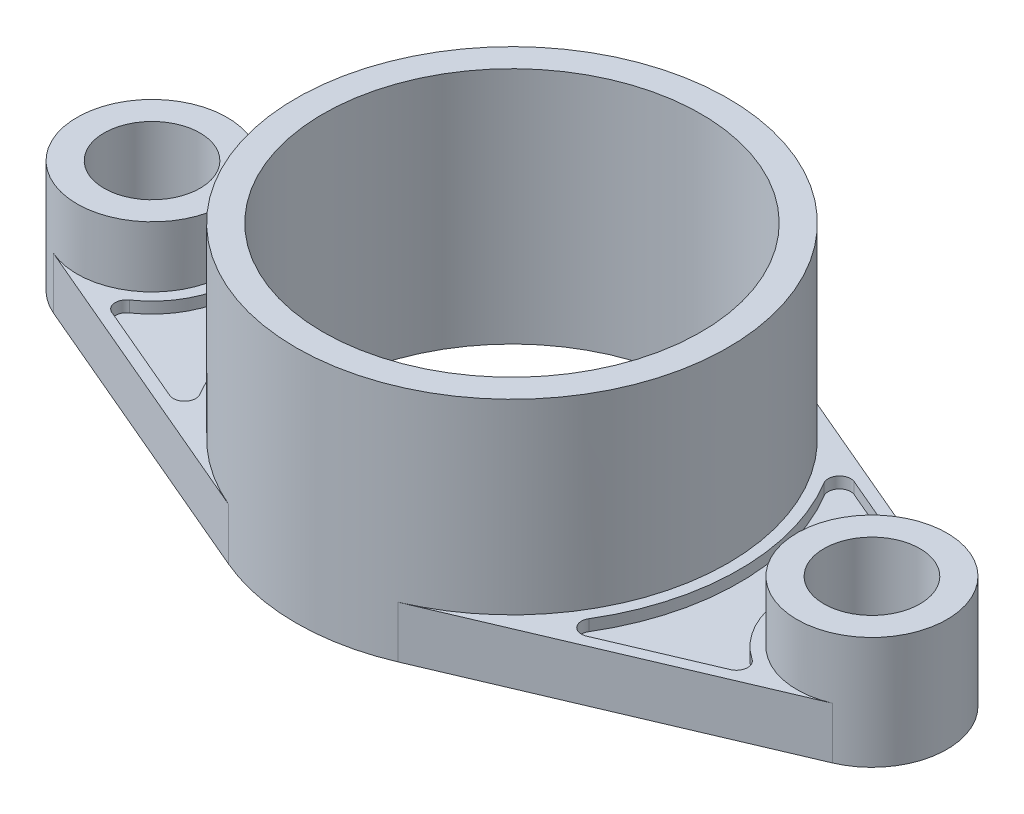
ISO-10303-21;
HEADER;
FILE_DESCRIPTION(('STEP AP214'),'2;1');
FILE_NAME('part.step','',(''),(''),'','','');
FILE_SCHEMA(('AUTOMOTIVE_DESIGN { 1 0 10303 214 1 1 1 1 }'));
ENDSEC;
DATA;
#1=APPLICATION_CONTEXT('core data for automotive mechanical design processes');
#2=APPLICATION_PROTOCOL_DEFINITION('international standard','automotive_design',2000,#1);
#3=PRODUCT_CONTEXT('',#1,'mechanical');
#4=PRODUCT('Part','Part','',(#3));
#5=PRODUCT_RELATED_PRODUCT_CATEGORY('part','',(#4));
#6=PRODUCT_DEFINITION_FORMATION('','',#4);
#7=PRODUCT_DEFINITION_CONTEXT('part definition',#1,'design');
#8=PRODUCT_DEFINITION('design','',#6,#7);
#9=PRODUCT_DEFINITION_SHAPE('','',#8);
#10=(LENGTH_UNIT() NAMED_UNIT(*) SI_UNIT(.MILLI.,.METRE.));
#11=(NAMED_UNIT(*) PLANE_ANGLE_UNIT() SI_UNIT($,.RADIAN.));
#12=(NAMED_UNIT(*) SI_UNIT($,.STERADIAN.) SOLID_ANGLE_UNIT());
#13=UNCERTAINTY_MEASURE_WITH_UNIT(LENGTH_MEASURE(1.E-05),#10,'distance_accuracy_value','');
#14=(GEOMETRIC_REPRESENTATION_CONTEXT(3) GLOBAL_UNCERTAINTY_ASSIGNED_CONTEXT((#13)) GLOBAL_UNIT_ASSIGNED_CONTEXT((#10,
#11,#12)) REPRESENTATION_CONTEXT('',''));
#15=CARTESIAN_POINT('',(0.,0.,0.));
#16=DIRECTION('',(0.,0.,1.));
#17=DIRECTION('',(1.,0.,0.));
#18=AXIS2_PLACEMENT_3D('',#15,#16,#17);
#19=CARTESIAN_POINT('',(0.,11.5,0.));
#20=DIRECTION('',(0.,1.,0.));
#21=DIRECTION('',(0.,0.,1.));
#22=AXIS2_PLACEMENT_3D('',#19,#20,#21);
#23=PLANE('',#22);
#24=DIRECTION('',(-0.920107179747132,0.,-0.391666666666669));
#25=VECTOR('',#24,1.);
#26=CARTESIAN_POINT('',(18.8000000000001,11.5,-44.1651446278623));
#27=LINE('',#26,#25);
#28=CARTESIAN_POINT('',(86.5277777777778,11.5,-15.335119662452));
#29=VERTEX_POINT('',#28);
#30=CARTESIAN_POINT('',(18.8000000000001,11.5,-44.1651446278623));
#31=VERTEX_POINT('',#30);
#32=EDGE_CURVE('E366',#29,#31,#27,.T.);
#33=ORIENTED_EDGE('',*,*,#32,.T.);
#34=CARTESIAN_POINT('',(0.,11.5,0.));
#35=DIRECTION('',(0.,1.,0.));
#36=DIRECTION('',(0.,0.,1.));
#37=AXIS2_PLACEMENT_3D('',#34,#35,#36);
#38=CIRCLE('',#37,48.);
#39=CARTESIAN_POINT('',(18.8000000000001,11.5,44.1651446278623));
#40=VERTEX_POINT('',#39);
#41=EDGE_CURVE('E341',#31,#40,#38,.F.);
#42=ORIENTED_EDGE('',*,*,#41,.T.);
#43=DIRECTION('',(-0.920107179747132,0.,0.391666666666669));
#44=VECTOR('',#43,1.);
#45=CARTESIAN_POINT('',(18.8000000000001,11.5,44.1651446278623));
#46=LINE('',#45,#44);
#47=CARTESIAN_POINT('',(86.5277777777777,11.5,15.335119662452));
#48=VERTEX_POINT('',#47);
#49=EDGE_CURVE('E363',#48,#40,#46,.T.);
#50=ORIENTED_EDGE('',*,*,#49,.F.);
#51=CARTESIAN_POINT('',(80.,11.5,0.));
#52=DIRECTION('',(0.,1.,0.));
#53=DIRECTION('',(0.,0.,1.));
#54=AXIS2_PLACEMENT_3D('',#51,#52,#53);
#55=CIRCLE('',#54,16.6666666666665);
#56=EDGE_CURVE('E352',#48,#29,#55,.F.);
#57=ORIENTED_EDGE('',*,*,#56,.T.);
#58=EDGE_LOOP('',(#33,#42,#50,#57));
#59=FACE_BOUND('',#58,.T.);
#60=DIRECTION('',(-0.920107179747132,0.,0.391666666666669));
#61=VECTOR('',#60,1.);
#62=CARTESIAN_POINT('',(68.749829188779,11.5,20.1856739916239));
#63=LINE('',#62,#61);
#64=CARTESIAN_POINT('',(68.749829188779,11.5,20.1856739916239));
#65=VERTEX_POINT('',#64);
#66=CARTESIAN_POINT('',(46.3293116044256,11.5,29.7295288603779));
#67=VERTEX_POINT('',#66);
#68=EDGE_CURVE('E244',#65,#67,#63,.T.);
#69=ORIENTED_EDGE('',*,*,#68,.T.);
#70=CARTESIAN_POINT('',(45.3501449377589,11.5,27.4292609110101));
#71=DIRECTION('',(0.,-1.,0.));
#72=DIRECTION('',(0.,0.,1.));
#73=AXIS2_PLACEMENT_3D('',#70,#71,#72);
#74=CIRCLE('',#73,2.5);
#75=CARTESIAN_POINT('',(43.2109871576759,11.5,26.13542784917));
#76=VERTEX_POINT('',#75);
#77=EDGE_CURVE('E60',#67,#76,#74,.T.);
#78=ORIENTED_EDGE('',*,*,#77,.T.);
#79=CARTESIAN_POINT('',(0.,11.5,0.));
#80=DIRECTION('',(0.,1.,0.));
#81=DIRECTION('',(0.,0.,1.));
#82=AXIS2_PLACEMENT_3D('',#79,#80,#81);
#83=CIRCLE('',#82,50.5);
#84=CARTESIAN_POINT('',(43.2109871576759,11.5,-26.1354278491699));
#85=VERTEX_POINT('',#84);
#86=EDGE_CURVE('E227',#76,#85,#83,.T.);
#87=ORIENTED_EDGE('',*,*,#86,.T.);
#88=CARTESIAN_POINT('',(45.3501449377589,11.5,-27.42926091101));
#89=DIRECTION('',(0.,-1.,0.));
#90=DIRECTION('',(0.,0.,1.));
#91=AXIS2_PLACEMENT_3D('',#88,#89,#90);
#92=CIRCLE('',#91,2.50000000000001);
#93=CARTESIAN_POINT('',(46.3293116044256,11.5,-29.7295288603779));
#94=VERTEX_POINT('',#93);
#95=EDGE_CURVE('E230',#85,#94,#92,.T.);
#96=ORIENTED_EDGE('',*,*,#95,.T.);
#97=DIRECTION('',(0.920107179747131,0.,0.39166666666667));
#98=VECTOR('',#97,1.);
#99=CARTESIAN_POINT('',(46.3293116044256,11.5,-29.7295288603779));
#100=LINE('',#99,#98);
#101=CARTESIAN_POINT('',(68.749829188779,11.5,-20.1856739916239));
#102=VERTEX_POINT('',#101);
#103=EDGE_CURVE('E255',#94,#102,#100,.T.);
#104=ORIENTED_EDGE('',*,*,#103,.T.);
#105=CARTESIAN_POINT('',(67.7706625221123,11.5,-17.8854060422561));
#106=DIRECTION('',(0.,-1.,0.));
#107=DIRECTION('',(0.,0.,1.));
#108=AXIS2_PLACEMENT_3D('',#105,#106,#107);
#109=CIRCLE('',#108,2.5);
#110=CARTESIAN_POINT('',(69.1817399234071,11.5,-15.8217053450726));
#111=VERTEX_POINT('',#110);
#112=EDGE_CURVE('E252',#102,#111,#109,.T.);
#113=ORIENTED_EDGE('',*,*,#112,.T.);
#114=CARTESIAN_POINT('',(80.,11.5,0.));
#115=DIRECTION('',(0.,1.,0.));
#116=DIRECTION('',(0.,0.,1.));
#117=AXIS2_PLACEMENT_3D('',#114,#115,#116);
#118=CIRCLE('',#117,19.1666666666665);
#119=CARTESIAN_POINT('',(69.1817399234071,11.5,15.8217053450727));
#120=VERTEX_POINT('',#119);
#121=EDGE_CURVE('E249',#111,#120,#118,.T.);
#122=ORIENTED_EDGE('',*,*,#121,.T.);
#123=CARTESIAN_POINT('',(67.7706625221124,11.5,17.8854060422561));
#124=DIRECTION('',(0.,-1.,0.));
#125=DIRECTION('',(0.,0.,-1.));
#126=AXIS2_PLACEMENT_3D('',#123,#124,#125);
#127=CIRCLE('',#126,2.5);
#128=EDGE_CURVE('E246',#120,#65,#127,.T.);
#129=ORIENTED_EDGE('',*,*,#128,.T.);
#130=EDGE_LOOP('',(#69,#78,#87,#96,#104,#113,#122,#129));
#131=FACE_BOUND('',#130,.T.);
#132=ADVANCED_FACE('F45',(#59,#131),#23,.T.);
#133=DIRECTION('',(0.920107179747132,0.,0.391666666666669));
#134=VECTOR('',#133,1.);
#135=CARTESIAN_POINT('',(-18.8000000000001,11.5,44.1651446278623));
#136=LINE('',#135,#134);
#137=CARTESIAN_POINT('',(-86.5277777777777,11.5,15.335119662452));
#138=VERTEX_POINT('',#137);
#139=CARTESIAN_POINT('',(-18.8000000000001,11.5,44.1651446278623));
#140=VERTEX_POINT('',#139);
#141=EDGE_CURVE('E361',#138,#140,#136,.T.);
#142=ORIENTED_EDGE('',*,*,#141,.T.);
#143=CARTESIAN_POINT('',(-18.8000000000001,11.5,-44.1651446278623));
#144=VERTEX_POINT('',#143);
#145=EDGE_CURVE('E342',#140,#144,#38,.F.);
#146=ORIENTED_EDGE('',*,*,#145,.T.);
#147=DIRECTION('',(0.920107179747132,0.,-0.391666666666669));
#148=VECTOR('',#147,1.);
#149=CARTESIAN_POINT('',(-18.8000000000001,11.5,-44.1651446278623));
#150=LINE('',#149,#148);
#151=CARTESIAN_POINT('',(-86.5277777777777,11.5,-15.335119662452));
#152=VERTEX_POINT('',#151);
#153=EDGE_CURVE('E368',#152,#144,#150,.T.);
#154=ORIENTED_EDGE('',*,*,#153,.F.);
#155=CARTESIAN_POINT('',(-80.,11.5,0.));
#156=DIRECTION('',(0.,1.,0.));
#157=DIRECTION('',(0.,0.,1.));
#158=AXIS2_PLACEMENT_3D('',#155,#156,#157);
#159=CIRCLE('',#158,16.6666666666665);
#160=EDGE_CURVE('E358',#152,#138,#159,.F.);
#161=ORIENTED_EDGE('',*,*,#160,.T.);
#162=EDGE_LOOP('',(#142,#146,#154,#161));
#163=FACE_BOUND('',#162,.T.);
#164=CARTESIAN_POINT('',(-45.3501449377589,11.5,27.4292609110101));
#165=DIRECTION('',(0.,1.,0.));
#166=DIRECTION('',(0.,0.,1.));
#167=AXIS2_PLACEMENT_3D('',#164,#165,#166);
#168=CIRCLE('',#167,2.5);
#169=CARTESIAN_POINT('',(-46.3293116044256,11.5,29.7295288603779));
#170=VERTEX_POINT('',#169);
#171=CARTESIAN_POINT('',(-43.2109871576759,11.5,26.13542784917));
#172=VERTEX_POINT('',#171);
#173=EDGE_CURVE('E68',#170,#172,#168,.T.);
#174=ORIENTED_EDGE('',*,*,#173,.F.);
#175=DIRECTION('',(0.920107179747132,0.,0.391666666666669));
#176=VECTOR('',#175,1.);
#177=CARTESIAN_POINT('',(-68.749829188779,11.5,20.1856739916239));
#178=LINE('',#177,#176);
#179=CARTESIAN_POINT('',(-68.749829188779,11.5,20.1856739916239));
#180=VERTEX_POINT('',#179);
#181=EDGE_CURVE('E277',#180,#170,#178,.T.);
#182=ORIENTED_EDGE('',*,*,#181,.F.);
#183=CARTESIAN_POINT('',(-67.7706625221124,11.5,17.8854060422561));
#184=DIRECTION('',(0.,1.,0.));
#185=DIRECTION('',(0.,0.,-1.));
#186=AXIS2_PLACEMENT_3D('',#183,#184,#185);
#187=CIRCLE('',#186,2.5);
#188=CARTESIAN_POINT('',(-69.1817399234071,11.5,15.8217053450727));
#189=VERTEX_POINT('',#188);
#190=EDGE_CURVE('E315',#189,#180,#187,.T.);
#191=ORIENTED_EDGE('',*,*,#190,.F.);
#192=CARTESIAN_POINT('',(-80.,11.5,0.));
#193=DIRECTION('',(0.,-1.,0.));
#194=DIRECTION('',(0.,0.,1.));
#195=AXIS2_PLACEMENT_3D('',#192,#193,#194);
#196=CIRCLE('',#195,19.1666666666665);
#197=CARTESIAN_POINT('',(-69.1817399234071,11.5,-15.8217053450726));
#198=VERTEX_POINT('',#197);
#199=EDGE_CURVE('E312',#198,#189,#196,.T.);
#200=ORIENTED_EDGE('',*,*,#199,.F.);
#201=CARTESIAN_POINT('',(-67.7706625221123,11.5,-17.8854060422561));
#202=DIRECTION('',(0.,1.,0.));
#203=DIRECTION('',(0.,0.,1.));
#204=AXIS2_PLACEMENT_3D('',#201,#202,#203);
#205=CIRCLE('',#204,2.5);
#206=CARTESIAN_POINT('',(-68.749829188779,11.5,-20.1856739916239));
#207=VERTEX_POINT('',#206);
#208=EDGE_CURVE('E309',#207,#198,#205,.T.);
#209=ORIENTED_EDGE('',*,*,#208,.F.);
#210=DIRECTION('',(-0.920107179747131,0.,0.39166666666667));
#211=VECTOR('',#210,1.);
#212=CARTESIAN_POINT('',(-46.3293116044256,11.5,-29.7295288603779));
#213=LINE('',#212,#211);
#214=CARTESIAN_POINT('',(-46.3293116044256,11.5,-29.7295288603779));
#215=VERTEX_POINT('',#214);
#216=EDGE_CURVE('E306',#215,#207,#213,.T.);
#217=ORIENTED_EDGE('',*,*,#216,.F.);
#218=CARTESIAN_POINT('',(-45.3501449377589,11.5,-27.42926091101));
#219=DIRECTION('',(0.,1.,0.));
#220=DIRECTION('',(0.,0.,1.));
#221=AXIS2_PLACEMENT_3D('',#218,#219,#220);
#222=CIRCLE('',#221,2.50000000000001);
#223=CARTESIAN_POINT('',(-43.2109871576759,11.5,-26.1354278491699));
#224=VERTEX_POINT('',#223);
#225=EDGE_CURVE('E303',#224,#215,#222,.T.);
#226=ORIENTED_EDGE('',*,*,#225,.F.);
#227=CARTESIAN_POINT('',(0.,11.5,0.));
#228=DIRECTION('',(0.,-1.,0.));
#229=DIRECTION('',(0.,0.,1.));
#230=AXIS2_PLACEMENT_3D('',#227,#228,#229);
#231=CIRCLE('',#230,50.5);
#232=EDGE_CURVE('E300',#172,#224,#231,.T.);
#233=ORIENTED_EDGE('',*,*,#232,.F.);
#234=EDGE_LOOP('',(#174,#182,#191,#200,#209,#217,#226,#233));
#235=FACE_BOUND('',#234,.T.);
#236=ADVANCED_FACE('F449',(#163,#235),#23,.T.);
#237=CARTESIAN_POINT('',(-80.,11.5,0.));
#238=DIRECTION('',(0.,-1.,0.));
#239=DIRECTION('',(0.,0.,-1.));
#240=AXIS2_PLACEMENT_3D('',#237,#238,#239);
#241=CYLINDRICAL_SURFACE('',#240,16.6666666666665);
#242=CARTESIAN_POINT('',(-80.,0.,0.));
#243=DIRECTION('',(0.,1.,0.));
#244=DIRECTION('',(0.,0.,1.));
#245=AXIS2_PLACEMENT_3D('',#242,#243,#244);
#246=CIRCLE('',#245,16.6666666666665);
#247=CARTESIAN_POINT('',(-86.5277777777777,0.,-15.335119662452));
#248=VERTEX_POINT('',#247);
#249=CARTESIAN_POINT('',(-86.5277777777777,0.,15.335119662452));
#250=VERTEX_POINT('',#249);
#251=EDGE_CURVE('E374',#248,#250,#246,.T.);
#252=ORIENTED_EDGE('',*,*,#251,.T.);
#253=DIRECTION('',(0.,-1.,0.));
#254=VECTOR('',#253,1.);
#255=CARTESIAN_POINT('',(-86.5277777777777,11.5,15.335119662452));
#256=LINE('',#255,#254);
#257=EDGE_CURVE('E11',#138,#250,#256,.T.);
#258=ORIENTED_EDGE('',*,*,#257,.F.);
#259=ORIENTED_EDGE('',*,*,#160,.F.);
#260=DIRECTION('',(0.,-1.,0.));
#261=VECTOR('',#260,1.);
#262=CARTESIAN_POINT('',(-86.5277777777777,11.5,-15.335119662452));
#263=LINE('',#262,#261);
#264=EDGE_CURVE('E371',#152,#248,#263,.T.);
#265=ORIENTED_EDGE('',*,*,#264,.T.);
#266=EDGE_LOOP('',(#252,#258,#259,#265));
#267=FACE_BOUND('',#266,.T.);
#268=CARTESIAN_POINT('',(-80.,25.,0.));
#269=DIRECTION('',(0.,1.,0.));
#270=DIRECTION('',(0.,0.,1.));
#271=AXIS2_PLACEMENT_3D('',#268,#269,#270);
#272=CIRCLE('',#271,16.6666666666665);
#273=CARTESIAN_POINT('',(-80.,25.,16.6666666666665));
#274=VERTEX_POINT('',#273);
#275=EDGE_CURVE('E348',#274,#274,#272,.T.);
#276=ORIENTED_EDGE('',*,*,#275,.F.);
#277=EDGE_LOOP('',(#276));
#278=FACE_BOUND('',#277,.T.);
#279=ADVANCED_FACE('F454',(#267,#278),#241,.T.);
#280=CARTESIAN_POINT('',(-18.8000000000001,11.5,44.1651446278623));
#281=DIRECTION('',(0.391666666666669,0.,-0.920107179747132));
#282=DIRECTION('',(-0.920107179747132,0.,-0.391666666666669));
#283=AXIS2_PLACEMENT_3D('',#280,#281,#282);
#284=PLANE('',#283);
#285=DIRECTION('',(0.920107179747132,0.,0.391666666666669));
#286=VECTOR('',#285,1.);
#287=CARTESIAN_POINT('',(-18.8000000000001,0.,44.1651446278623));
#288=LINE('',#287,#286);
#289=CARTESIAN_POINT('',(-18.8000000000001,0.,44.1651446278623));
#290=VERTEX_POINT('',#289);
#291=EDGE_CURVE('E377',#250,#290,#288,.T.);
#292=ORIENTED_EDGE('',*,*,#291,.T.);
#293=DIRECTION('',(0.,-1.,0.));
#294=VECTOR('',#293,1.);
#295=CARTESIAN_POINT('',(-18.8000000000001,11.5,44.1651446278623));
#296=LINE('',#295,#294);
#297=EDGE_CURVE('E53',#140,#290,#296,.T.);
#298=ORIENTED_EDGE('',*,*,#297,.F.);
#299=ORIENTED_EDGE('',*,*,#141,.F.);
#300=ORIENTED_EDGE('',*,*,#257,.T.);
#301=EDGE_LOOP('',(#292,#298,#299,#300));
#302=FACE_BOUND('',#301,.T.);
#303=ADVANCED_FACE('F452',(#302),#284,.F.);
#304=CARTESIAN_POINT('',(18.8000000000001,11.5,44.1651446278623));
#305=DIRECTION('',(0.391666666666669,0.,0.920107179747132));
#306=DIRECTION('',(0.920107179747132,0.,-0.391666666666669));
#307=AXIS2_PLACEMENT_3D('',#304,#305,#306);
#308=PLANE('',#307);
#309=DIRECTION('',(-0.920107179747132,0.,0.391666666666669));
#310=VECTOR('',#309,1.);
#311=CARTESIAN_POINT('',(18.8000000000001,0.,44.1651446278623));
#312=LINE('',#311,#310);
#313=CARTESIAN_POINT('',(86.5277777777777,0.,15.335119662452));
#314=VERTEX_POINT('',#313);
#315=CARTESIAN_POINT('',(18.8000000000001,0.,44.1651446278623));
#316=VERTEX_POINT('',#315);
#317=EDGE_CURVE('E382',#314,#316,#312,.T.);
#318=ORIENTED_EDGE('',*,*,#317,.F.);
#319=DIRECTION('',(0.,-1.,0.));
#320=VECTOR('',#319,1.);
#321=CARTESIAN_POINT('',(86.5277777777777,11.5,15.335119662452));
#322=LINE('',#321,#320);
#323=EDGE_CURVE('E407',#48,#314,#322,.T.);
#324=ORIENTED_EDGE('',*,*,#323,.F.);
#325=ORIENTED_EDGE('',*,*,#49,.T.);
#326=DIRECTION('',(0.,-1.,0.));
#327=VECTOR('',#326,1.);
#328=CARTESIAN_POINT('',(18.8000000000001,11.5,44.1651446278623));
#329=LINE('',#328,#327);
#330=EDGE_CURVE('E409',#40,#316,#329,.T.);
#331=ORIENTED_EDGE('',*,*,#330,.T.);
#332=EDGE_LOOP('',(#318,#324,#325,#331));
#333=FACE_BOUND('',#332,.T.);
#334=ADVANCED_FACE('F431',(#333),#308,.T.);
#335=CARTESIAN_POINT('',(80.,11.5,0.));
#336=DIRECTION('',(0.,-1.,0.));
#337=DIRECTION('',(0.,0.,-1.));
#338=AXIS2_PLACEMENT_3D('',#335,#336,#337);
#339=CYLINDRICAL_SURFACE('',#338,16.6666666666665);
#340=CARTESIAN_POINT('',(80.,0.,0.));
#341=DIRECTION('',(0.,1.,0.));
#342=DIRECTION('',(0.,0.,1.));
#343=AXIS2_PLACEMENT_3D('',#340,#341,#342);
#344=CIRCLE('',#343,16.6666666666665);
#345=CARTESIAN_POINT('',(86.5277777777778,0.,-15.335119662452));
#346=VERTEX_POINT('',#345);
#347=EDGE_CURVE('E386',#314,#346,#344,.T.);
#348=ORIENTED_EDGE('',*,*,#347,.T.);
#349=DIRECTION('',(0.,-1.,0.));
#350=VECTOR('',#349,1.);
#351=CARTESIAN_POINT('',(86.5277777777778,11.5,-15.335119662452));
#352=LINE('',#351,#350);
#353=EDGE_CURVE('E404',#29,#346,#352,.T.);
#354=ORIENTED_EDGE('',*,*,#353,.F.);
#355=ORIENTED_EDGE('',*,*,#56,.F.);
#356=ORIENTED_EDGE('',*,*,#323,.T.);
#357=EDGE_LOOP('',(#348,#354,#355,#356));
#358=FACE_BOUND('',#357,.T.);
#359=CARTESIAN_POINT('',(80.,25.,0.));
#360=DIRECTION('',(0.,1.,0.));
#361=DIRECTION('',(0.,0.,1.));
#362=AXIS2_PLACEMENT_3D('',#359,#360,#361);
#363=CIRCLE('',#362,16.6666666666665);
#364=CARTESIAN_POINT('',(80.,25.,16.6666666666665));
#365=VERTEX_POINT('',#364);
#366=EDGE_CURVE('E349',#365,#365,#363,.T.);
#367=ORIENTED_EDGE('',*,*,#366,.F.);
#368=EDGE_LOOP('',(#367));
#369=FACE_BOUND('',#368,.T.);
#370=ADVANCED_FACE('F500',(#358,#369),#339,.T.);
#371=CARTESIAN_POINT('',(18.8000000000001,11.5,-44.1651446278623));
#372=DIRECTION('',(-0.391666666666669,0.,0.920107179747132));
#373=DIRECTION('',(0.920107179747132,0.,0.391666666666669));
#374=AXIS2_PLACEMENT_3D('',#371,#372,#373);
#375=PLANE('',#374);
#376=DIRECTION('',(-0.920107179747132,0.,-0.391666666666669));
#377=VECTOR('',#376,1.);
#378=CARTESIAN_POINT('',(18.8000000000001,0.,-44.1651446278623));
#379=LINE('',#378,#377);
#380=CARTESIAN_POINT('',(18.8000000000001,0.,-44.1651446278623));
#381=VERTEX_POINT('',#380);
#382=EDGE_CURVE('E388',#346,#381,#379,.T.);
#383=ORIENTED_EDGE('',*,*,#382,.T.);
#384=DIRECTION('',(0.,-1.,0.));
#385=VECTOR('',#384,1.);
#386=CARTESIAN_POINT('',(18.8000000000001,11.5,-44.1651446278623));
#387=LINE('',#386,#385);
#388=EDGE_CURVE('E401',#31,#381,#387,.T.);
#389=ORIENTED_EDGE('',*,*,#388,.F.);
#390=ORIENTED_EDGE('',*,*,#32,.F.);
#391=ORIENTED_EDGE('',*,*,#353,.T.);
#392=EDGE_LOOP('',(#383,#389,#390,#391));
#393=FACE_BOUND('',#392,.T.);
#394=ADVANCED_FACE('F441',(#393),#375,.F.);
#395=CARTESIAN_POINT('',(0.,11.5,0.));
#396=DIRECTION('',(0.,-1.,0.));
#397=DIRECTION('',(0.,0.,-1.));
#398=AXIS2_PLACEMENT_3D('',#395,#396,#397);
#399=CYLINDRICAL_SURFACE('',#398,48.);
#400=CARTESIAN_POINT('',(0.,0.,0.));
#401=DIRECTION('',(0.,1.,0.));
#402=DIRECTION('',(0.,0.,1.));
#403=AXIS2_PLACEMENT_3D('',#400,#401,#402);
#404=CIRCLE('',#403,48.);
#405=CARTESIAN_POINT('',(-18.8000000000001,0.,-44.1651446278623));
#406=VERTEX_POINT('',#405);
#407=EDGE_CURVE('E383',#381,#406,#404,.T.);
#408=ORIENTED_EDGE('',*,*,#407,.T.);
#409=DIRECTION('',(0.,-1.,0.));
#410=VECTOR('',#409,1.);
#411=CARTESIAN_POINT('',(-18.8000000000001,11.5,-44.1651446278623));
#412=LINE('',#411,#410);
#413=EDGE_CURVE('E399',#144,#406,#412,.T.);
#414=ORIENTED_EDGE('',*,*,#413,.F.);
#415=ORIENTED_EDGE('',*,*,#145,.F.);
#416=ORIENTED_EDGE('',*,*,#297,.T.);
#417=EDGE_CURVE('E379',#290,#316,#404,.T.);
#418=ORIENTED_EDGE('',*,*,#417,.T.);
#419=ORIENTED_EDGE('',*,*,#330,.F.);
#420=ORIENTED_EDGE('',*,*,#41,.F.);
#421=ORIENTED_EDGE('',*,*,#388,.T.);
#422=EDGE_LOOP('',(#408,#414,#415,#416,#418,#419,#420,#421));
#423=FACE_BOUND('',#422,.T.);
#424=CARTESIAN_POINT('',(0.,53.,0.));
#425=DIRECTION('',(0.,1.,0.));
#426=DIRECTION('',(0.,0.,1.));
#427=AXIS2_PLACEMENT_3D('',#424,#425,#426);
#428=CIRCLE('',#427,48.);
#429=CARTESIAN_POINT('',(0.,53.,48.));
#430=VERTEX_POINT('',#429);
#431=EDGE_CURVE('E322',#430,#430,#428,.T.);
#432=ORIENTED_EDGE('',*,*,#431,.F.);
#433=EDGE_LOOP('',(#432));
#434=FACE_BOUND('',#433,.T.);
#435=ADVANCED_FACE('F416',(#423,#434),#399,.T.);
#436=CARTESIAN_POINT('',(0.,11.5,0.));
#437=DIRECTION('',(0.,-1.,0.));
#438=DIRECTION('',(0.,0.,-1.));
#439=AXIS2_PLACEMENT_3D('',#436,#437,#438);
#440=CYLINDRICAL_SURFACE('',#439,42.);
#441=CARTESIAN_POINT('',(0.,0.,0.));
#442=DIRECTION('',(0.,1.,0.));
#443=DIRECTION('',(0.,0.,1.));
#444=AXIS2_PLACEMENT_3D('',#441,#442,#443);
#445=CIRCLE('',#444,42.);
#446=CARTESIAN_POINT('',(0.,0.,42.));
#447=VERTEX_POINT('',#446);
#448=EDGE_CURVE('E393',#447,#447,#445,.T.);
#449=ORIENTED_EDGE('',*,*,#448,.F.);
#450=EDGE_LOOP('',(#449));
#451=FACE_BOUND('',#450,.T.);
#452=CARTESIAN_POINT('',(0.,53.,0.));
#453=DIRECTION('',(0.,1.,0.));
#454=DIRECTION('',(0.,0.,1.));
#455=AXIS2_PLACEMENT_3D('',#452,#453,#454);
#456=CIRCLE('',#455,42.);
#457=CARTESIAN_POINT('',(0.,53.,42.));
#458=VERTEX_POINT('',#457);
#459=EDGE_CURVE('E338',#458,#458,#456,.T.);
#460=ORIENTED_EDGE('',*,*,#459,.T.);
#461=EDGE_LOOP('',(#460));
#462=FACE_BOUND('',#461,.T.);
#463=ADVANCED_FACE('F490',(#451,#462),#440,.F.);
#464=CARTESIAN_POINT('',(-18.8000000000001,11.5,-44.1651446278623));
#465=DIRECTION('',(-0.391666666666669,0.,-0.920107179747132));
#466=DIRECTION('',(-0.920107179747132,0.,0.391666666666669));
#467=AXIS2_PLACEMENT_3D('',#464,#465,#466);
#468=PLANE('',#467);
#469=DIRECTION('',(0.920107179747132,0.,-0.391666666666669));
#470=VECTOR('',#469,1.);
#471=CARTESIAN_POINT('',(-18.8000000000001,0.,-44.1651446278623));
#472=LINE('',#471,#470);
#473=EDGE_CURVE('E390',#248,#406,#472,.T.);
#474=ORIENTED_EDGE('',*,*,#473,.F.);
#475=ORIENTED_EDGE('',*,*,#264,.F.);
#476=ORIENTED_EDGE('',*,*,#153,.T.);
#477=ORIENTED_EDGE('',*,*,#413,.T.);
#478=EDGE_LOOP('',(#474,#475,#476,#477));
#479=FACE_BOUND('',#478,.T.);
#480=ADVANCED_FACE('F446',(#479),#468,.T.);
#481=CARTESIAN_POINT('',(-80.,11.5,0.));
#482=DIRECTION('',(0.,-1.,0.));
#483=DIRECTION('',(0.,0.,-1.));
#484=AXIS2_PLACEMENT_3D('',#481,#482,#483);
#485=CYLINDRICAL_SURFACE('',#484,10.6666666666667);
#486=CARTESIAN_POINT('',(-80.,0.,0.));
#487=DIRECTION('',(0.,1.,0.));
#488=DIRECTION('',(0.,0.,1.));
#489=AXIS2_PLACEMENT_3D('',#486,#487,#488);
#490=CIRCLE('',#489,10.6666666666667);
#491=CARTESIAN_POINT('',(-80.,0.,10.6666666666667));
#492=VERTEX_POINT('',#491);
#493=EDGE_CURVE('E360',#492,#492,#490,.T.);
#494=ORIENTED_EDGE('',*,*,#493,.F.);
#495=EDGE_LOOP('',(#494));
#496=FACE_BOUND('',#495,.T.);
#497=CARTESIAN_POINT('',(-80.,25.,0.));
#498=DIRECTION('',(0.,1.,0.));
#499=DIRECTION('',(0.,0.,1.));
#500=AXIS2_PLACEMENT_3D('',#497,#498,#499);
#501=CIRCLE('',#500,10.6666666666667);
#502=CARTESIAN_POINT('',(-80.,25.,10.6666666666667));
#503=VERTEX_POINT('',#502);
#504=EDGE_CURVE('E345',#503,#503,#501,.T.);
#505=ORIENTED_EDGE('',*,*,#504,.T.);
#506=EDGE_LOOP('',(#505));
#507=FACE_BOUND('',#506,.T.);
#508=ADVANCED_FACE('F47',(#496,#507),#485,.F.);
#509=CARTESIAN_POINT('',(80.,11.5,0.));
#510=DIRECTION('',(0.,-1.,0.));
#511=DIRECTION('',(0.,0.,-1.));
#512=AXIS2_PLACEMENT_3D('',#509,#510,#511);
#513=CYLINDRICAL_SURFACE('',#512,10.6666666666667);
#514=CARTESIAN_POINT('',(80.,0.,0.));
#515=DIRECTION('',(0.,1.,0.));
#516=DIRECTION('',(0.,0.,1.));
#517=AXIS2_PLACEMENT_3D('',#514,#515,#516);
#518=CIRCLE('',#517,10.6666666666667);
#519=CARTESIAN_POINT('',(80.,0.,10.6666666666667));
#520=VERTEX_POINT('',#519);
#521=EDGE_CURVE('E364',#520,#520,#518,.T.);
#522=ORIENTED_EDGE('',*,*,#521,.F.);
#523=EDGE_LOOP('',(#522));
#524=FACE_BOUND('',#523,.T.);
#525=CARTESIAN_POINT('',(80.,25.,0.));
#526=DIRECTION('',(0.,1.,0.));
#527=DIRECTION('',(0.,0.,1.));
#528=AXIS2_PLACEMENT_3D('',#525,#526,#527);
#529=CIRCLE('',#528,10.6666666666667);
#530=CARTESIAN_POINT('',(80.,25.,10.6666666666667));
#531=VERTEX_POINT('',#530);
#532=EDGE_CURVE('E344',#531,#531,#529,.T.);
#533=ORIENTED_EDGE('',*,*,#532,.T.);
#534=EDGE_LOOP('',(#533));
#535=FACE_BOUND('',#534,.T.);
#536=ADVANCED_FACE('F486',(#524,#535),#513,.F.);
#537=CARTESIAN_POINT('',(0.,0.,0.));
#538=DIRECTION('',(0.,1.,0.));
#539=DIRECTION('',(0.,0.,1.));
#540=AXIS2_PLACEMENT_3D('',#537,#538,#539);
#541=PLANE('',#540);
#542=ORIENTED_EDGE('',*,*,#417,.F.);
#543=ORIENTED_EDGE('',*,*,#291,.F.);
#544=ORIENTED_EDGE('',*,*,#251,.F.);
#545=ORIENTED_EDGE('',*,*,#473,.T.);
#546=ORIENTED_EDGE('',*,*,#407,.F.);
#547=ORIENTED_EDGE('',*,*,#382,.F.);
#548=ORIENTED_EDGE('',*,*,#347,.F.);
#549=ORIENTED_EDGE('',*,*,#317,.T.);
#550=EDGE_LOOP('',(#542,#543,#544,#545,#546,#547,#548,#549));
#551=FACE_BOUND('',#550,.T.);
#552=ORIENTED_EDGE('',*,*,#448,.T.);
#553=EDGE_LOOP('',(#552));
#554=FACE_BOUND('',#553,.T.);
#555=ORIENTED_EDGE('',*,*,#521,.T.);
#556=EDGE_LOOP('',(#555));
#557=FACE_BOUND('',#556,.T.);
#558=ORIENTED_EDGE('',*,*,#493,.T.);
#559=EDGE_LOOP('',(#558));
#560=FACE_BOUND('',#559,.T.);
#561=ADVANCED_FACE('F423',(#551,#554,#557,#560),#541,.F.);
#562=CARTESIAN_POINT('',(0.,25.,0.));
#563=DIRECTION('',(0.,1.,0.));
#564=DIRECTION('',(0.,0.,1.));
#565=AXIS2_PLACEMENT_3D('',#562,#563,#564);
#566=PLANE('',#565);
#567=ORIENTED_EDGE('',*,*,#532,.F.);
#568=EDGE_LOOP('',(#567));
#569=FACE_BOUND('',#568,.T.);
#570=ORIENTED_EDGE('',*,*,#366,.T.);
#571=EDGE_LOOP('',(#570));
#572=FACE_BOUND('',#571,.T.);
#573=ADVANCED_FACE('F462',(#569,#572),#566,.T.);
#574=CARTESIAN_POINT('',(0.,25.,0.));
#575=DIRECTION('',(0.,1.,0.));
#576=DIRECTION('',(0.,0.,1.));
#577=AXIS2_PLACEMENT_3D('',#574,#575,#576);
#578=PLANE('',#577);
#579=ORIENTED_EDGE('',*,*,#504,.F.);
#580=EDGE_LOOP('',(#579));
#581=FACE_BOUND('',#580,.T.);
#582=ORIENTED_EDGE('',*,*,#275,.T.);
#583=EDGE_LOOP('',(#582));
#584=FACE_BOUND('',#583,.T.);
#585=ADVANCED_FACE('F459',(#581,#584),#578,.T.);
#586=CARTESIAN_POINT('',(0.,53.,0.));
#587=DIRECTION('',(0.,1.,0.));
#588=DIRECTION('',(0.,0.,1.));
#589=AXIS2_PLACEMENT_3D('',#586,#587,#588);
#590=PLANE('',#589);
#591=ORIENTED_EDGE('',*,*,#431,.T.);
#592=EDGE_LOOP('',(#591));
#593=FACE_BOUND('',#592,.T.);
#594=ORIENTED_EDGE('',*,*,#459,.F.);
#595=EDGE_LOOP('',(#594));
#596=FACE_BOUND('',#595,.T.);
#597=ADVANCED_FACE('F461',(#593,#596),#590,.T.);
#598=CARTESIAN_POINT('',(-45.3501449377589,9.,27.4292609110101));
#599=DIRECTION('',(0.,1.,0.));
#600=DIRECTION('',(0.,0.,1.));
#601=AXIS2_PLACEMENT_3D('',#598,#599,#600);
#602=CYLINDRICAL_SURFACE('',#601,2.5);
#603=ORIENTED_EDGE('',*,*,#173,.T.);
#604=DIRECTION('',(0.,1.,0.));
#605=VECTOR('',#604,1.);
#606=CARTESIAN_POINT('',(-43.2109871576759,9.,26.13542784917));
#607=LINE('',#606,#605);
#608=CARTESIAN_POINT('',(-43.2109871576759,9.,26.13542784917));
#609=VERTEX_POINT('',#608);
#610=EDGE_CURVE('E298',#609,#172,#607,.T.);
#611=ORIENTED_EDGE('',*,*,#610,.F.);
#612=CARTESIAN_POINT('',(-45.3501449377589,9.,27.4292609110101));
#613=DIRECTION('',(0.,1.,0.));
#614=DIRECTION('',(0.,0.,1.));
#615=AXIS2_PLACEMENT_3D('',#612,#613,#614);
#616=CIRCLE('',#615,2.5);
#617=CARTESIAN_POINT('',(-46.3293116044256,9.,29.7295288603779));
#618=VERTEX_POINT('',#617);
#619=EDGE_CURVE('E273',#618,#609,#616,.T.);
#620=ORIENTED_EDGE('',*,*,#619,.F.);
#621=DIRECTION('',(0.,1.,0.));
#622=VECTOR('',#621,1.);
#623=CARTESIAN_POINT('',(-46.3293116044256,9.,29.7295288603779));
#624=LINE('',#623,#622);
#625=EDGE_CURVE('E320',#618,#170,#624,.T.);
#626=ORIENTED_EDGE('',*,*,#625,.T.);
#627=EDGE_LOOP('',(#603,#611,#620,#626));
#628=FACE_BOUND('',#627,.T.);
#629=ADVANCED_FACE('F470',(#628),#602,.F.);
#630=CARTESIAN_POINT('',(-68.749829188779,9.,20.1856739916239));
#631=DIRECTION('',(-0.391666666666669,0.,0.920107179747131));
#632=DIRECTION('',(0.920107179747131,0.,0.391666666666669));
#633=AXIS2_PLACEMENT_3D('',#630,#631,#632);
#634=PLANE('',#633);
#635=ORIENTED_EDGE('',*,*,#181,.T.);
#636=ORIENTED_EDGE('',*,*,#625,.F.);
#637=DIRECTION('',(0.920107179747132,0.,0.391666666666669));
#638=VECTOR('',#637,1.);
#639=CARTESIAN_POINT('',(-68.749829188779,9.,20.1856739916239));
#640=LINE('',#639,#638);
#641=CARTESIAN_POINT('',(-68.749829188779,9.,20.1856739916239));
#642=VERTEX_POINT('',#641);
#643=EDGE_CURVE('E295',#642,#618,#640,.T.);
#644=ORIENTED_EDGE('',*,*,#643,.F.);
#645=DIRECTION('',(0.,1.,0.));
#646=VECTOR('',#645,1.);
#647=CARTESIAN_POINT('',(-68.749829188779,9.,20.1856739916239));
#648=LINE('',#647,#646);
#649=EDGE_CURVE('E323',#642,#180,#648,.T.);
#650=ORIENTED_EDGE('',*,*,#649,.T.);
#651=EDGE_LOOP('',(#635,#636,#644,#650));
#652=FACE_BOUND('',#651,.T.);
#653=ADVANCED_FACE('F557',(#652),#634,.F.);
#654=CARTESIAN_POINT('',(-67.7706625221124,9.,17.8854060422561));
#655=DIRECTION('',(0.,1.,0.));
#656=DIRECTION('',(0.,0.,1.));
#657=AXIS2_PLACEMENT_3D('',#654,#655,#656);
#658=CYLINDRICAL_SURFACE('',#657,2.5);
#659=ORIENTED_EDGE('',*,*,#190,.T.);
#660=ORIENTED_EDGE('',*,*,#649,.F.);
#661=CARTESIAN_POINT('',(-67.7706625221124,9.,17.8854060422561));
#662=DIRECTION('',(0.,1.,0.));
#663=DIRECTION('',(0.,0.,-1.));
#664=AXIS2_PLACEMENT_3D('',#661,#662,#663);
#665=CIRCLE('',#664,2.5);
#666=CARTESIAN_POINT('',(-69.1817399234071,9.,15.8217053450727));
#667=VERTEX_POINT('',#666);
#668=EDGE_CURVE('E292',#667,#642,#665,.T.);
#669=ORIENTED_EDGE('',*,*,#668,.F.);
#670=DIRECTION('',(0.,1.,0.));
#671=VECTOR('',#670,1.);
#672=CARTESIAN_POINT('',(-69.1817399234071,9.,15.8217053450727));
#673=LINE('',#672,#671);
#674=EDGE_CURVE('E325',#667,#189,#673,.T.);
#675=ORIENTED_EDGE('',*,*,#674,.T.);
#676=EDGE_LOOP('',(#659,#660,#669,#675));
#677=FACE_BOUND('',#676,.T.);
#678=ADVANCED_FACE('F565',(#677),#658,.F.);
#679=CARTESIAN_POINT('',(-80.,9.,0.));
#680=DIRECTION('',(0.,1.,0.));
#681=DIRECTION('',(0.,0.,1.));
#682=AXIS2_PLACEMENT_3D('',#679,#680,#681);
#683=CYLINDRICAL_SURFACE('',#682,19.1666666666665);
#684=ORIENTED_EDGE('',*,*,#199,.T.);
#685=ORIENTED_EDGE('',*,*,#674,.F.);
#686=CARTESIAN_POINT('',(-80.,9.,0.));
#687=DIRECTION('',(0.,-1.,0.));
#688=DIRECTION('',(0.,0.,1.));
#689=AXIS2_PLACEMENT_3D('',#686,#687,#688);
#690=CIRCLE('',#689,19.1666666666665);
#691=CARTESIAN_POINT('',(-69.1817399234071,9.,-15.8217053450726));
#692=VERTEX_POINT('',#691);
#693=EDGE_CURVE('E289',#692,#667,#690,.T.);
#694=ORIENTED_EDGE('',*,*,#693,.F.);
#695=DIRECTION('',(0.,1.,0.));
#696=VECTOR('',#695,1.);
#697=CARTESIAN_POINT('',(-69.1817399234071,9.,-15.8217053450726));
#698=LINE('',#697,#696);
#699=EDGE_CURVE('E327',#692,#198,#698,.T.);
#700=ORIENTED_EDGE('',*,*,#699,.T.);
#701=EDGE_LOOP('',(#684,#685,#694,#700));
#702=FACE_BOUND('',#701,.T.);
#703=ADVANCED_FACE('F574',(#702),#683,.T.);
#704=CARTESIAN_POINT('',(-67.7706625221123,9.,-17.8854060422561));
#705=DIRECTION('',(0.,1.,0.));
#706=DIRECTION('',(0.,0.,1.));
#707=AXIS2_PLACEMENT_3D('',#704,#705,#706);
#708=CYLINDRICAL_SURFACE('',#707,2.5);
#709=ORIENTED_EDGE('',*,*,#208,.T.);
#710=ORIENTED_EDGE('',*,*,#699,.F.);
#711=CARTESIAN_POINT('',(-67.7706625221123,9.,-17.8854060422561));
#712=DIRECTION('',(0.,1.,0.));
#713=DIRECTION('',(0.,0.,1.));
#714=AXIS2_PLACEMENT_3D('',#711,#712,#713);
#715=CIRCLE('',#714,2.5);
#716=CARTESIAN_POINT('',(-68.749829188779,9.,-20.1856739916239));
#717=VERTEX_POINT('',#716);
#718=EDGE_CURVE('E286',#717,#692,#715,.T.);
#719=ORIENTED_EDGE('',*,*,#718,.F.);
#720=DIRECTION('',(0.,1.,0.));
#721=VECTOR('',#720,1.);
#722=CARTESIAN_POINT('',(-68.749829188779,9.,-20.1856739916239));
#723=LINE('',#722,#721);
#724=EDGE_CURVE('E329',#717,#207,#723,.T.);
#725=ORIENTED_EDGE('',*,*,#724,.T.);
#726=EDGE_LOOP('',(#709,#710,#719,#725));
#727=FACE_BOUND('',#726,.T.);
#728=ADVANCED_FACE('F583',(#727),#708,.F.);
#729=CARTESIAN_POINT('',(-46.3293116044256,9.,-29.7295288603779));
#730=DIRECTION('',(-0.39166666666667,0.,-0.920107179747131));
#731=DIRECTION('',(-0.920107179747131,0.,0.39166666666667));
#732=AXIS2_PLACEMENT_3D('',#729,#730,#731);
#733=PLANE('',#732);
#734=ORIENTED_EDGE('',*,*,#216,.T.);
#735=ORIENTED_EDGE('',*,*,#724,.F.);
#736=DIRECTION('',(-0.920107179747131,0.,0.39166666666667));
#737=VECTOR('',#736,1.);
#738=CARTESIAN_POINT('',(-46.3293116044256,9.,-29.7295288603779));
#739=LINE('',#738,#737);
#740=CARTESIAN_POINT('',(-46.3293116044256,9.,-29.7295288603779));
#741=VERTEX_POINT('',#740);
#742=EDGE_CURVE('E283',#741,#717,#739,.T.);
#743=ORIENTED_EDGE('',*,*,#742,.F.);
#744=DIRECTION('',(0.,1.,0.));
#745=VECTOR('',#744,1.);
#746=CARTESIAN_POINT('',(-46.3293116044256,9.,-29.7295288603779));
#747=LINE('',#746,#745);
#748=EDGE_CURVE('E331',#741,#215,#747,.T.);
#749=ORIENTED_EDGE('',*,*,#748,.T.);
#750=EDGE_LOOP('',(#734,#735,#743,#749));
#751=FACE_BOUND('',#750,.T.);
#752=ADVANCED_FACE('F592',(#751),#733,.F.);
#753=CARTESIAN_POINT('',(-45.3501449377589,9.,-27.42926091101));
#754=DIRECTION('',(0.,1.,0.));
#755=DIRECTION('',(0.,0.,1.));
#756=AXIS2_PLACEMENT_3D('',#753,#754,#755);
#757=CYLINDRICAL_SURFACE('',#756,2.50000000000001);
#758=ORIENTED_EDGE('',*,*,#225,.T.);
#759=ORIENTED_EDGE('',*,*,#748,.F.);
#760=CARTESIAN_POINT('',(-45.3501449377589,9.,-27.42926091101));
#761=DIRECTION('',(0.,1.,0.));
#762=DIRECTION('',(0.,0.,1.));
#763=AXIS2_PLACEMENT_3D('',#760,#761,#762);
#764=CIRCLE('',#763,2.50000000000001);
#765=CARTESIAN_POINT('',(-43.2109871576759,9.,-26.1354278491699));
#766=VERTEX_POINT('',#765);
#767=EDGE_CURVE('E280',#766,#741,#764,.T.);
#768=ORIENTED_EDGE('',*,*,#767,.F.);
#769=DIRECTION('',(0.,1.,0.));
#770=VECTOR('',#769,1.);
#771=CARTESIAN_POINT('',(-43.2109871576759,9.,-26.1354278491699));
#772=LINE('',#771,#770);
#773=EDGE_CURVE('E333',#766,#224,#772,.T.);
#774=ORIENTED_EDGE('',*,*,#773,.T.);
#775=EDGE_LOOP('',(#758,#759,#768,#774));
#776=FACE_BOUND('',#775,.T.);
#777=ADVANCED_FACE('F601',(#776),#757,.F.);
#778=CARTESIAN_POINT('',(0.,9.,0.));
#779=DIRECTION('',(0.,1.,0.));
#780=DIRECTION('',(0.,0.,1.));
#781=AXIS2_PLACEMENT_3D('',#778,#779,#780);
#782=CYLINDRICAL_SURFACE('',#781,50.5);
#783=ORIENTED_EDGE('',*,*,#232,.T.);
#784=ORIENTED_EDGE('',*,*,#773,.F.);
#785=CARTESIAN_POINT('',(0.,9.,0.));
#786=DIRECTION('',(0.,-1.,0.));
#787=DIRECTION('',(0.,0.,1.));
#788=AXIS2_PLACEMENT_3D('',#785,#786,#787);
#789=CIRCLE('',#788,50.5);
#790=EDGE_CURVE('E276',#609,#766,#789,.T.);
#791=ORIENTED_EDGE('',*,*,#790,.F.);
#792=ORIENTED_EDGE('',*,*,#610,.T.);
#793=EDGE_LOOP('',(#783,#784,#791,#792));
#794=FACE_BOUND('',#793,.T.);
#795=ADVANCED_FACE('F610',(#794),#782,.T.);
#796=CARTESIAN_POINT('',(-45.3501449377589,9.,27.4292609110101));
#797=DIRECTION('',(0.,1.,0.));
#798=DIRECTION('',(0.,0.,1.));
#799=AXIS2_PLACEMENT_3D('',#796,#797,#798);
#800=PLANE('',#799);
#801=ORIENTED_EDGE('',*,*,#619,.T.);
#802=ORIENTED_EDGE('',*,*,#790,.T.);
#803=ORIENTED_EDGE('',*,*,#767,.T.);
#804=ORIENTED_EDGE('',*,*,#742,.T.);
#805=ORIENTED_EDGE('',*,*,#718,.T.);
#806=ORIENTED_EDGE('',*,*,#693,.T.);
#807=ORIENTED_EDGE('',*,*,#668,.T.);
#808=ORIENTED_EDGE('',*,*,#643,.T.);
#809=EDGE_LOOP('',(#801,#802,#803,#804,#805,#806,#807,#808));
#810=FACE_BOUND('',#809,.T.);
#811=ADVANCED_FACE('F618',(#810),#800,.T.);
#812=CARTESIAN_POINT('',(45.3501449377589,9.,27.4292609110101));
#813=DIRECTION('',(0.,1.,0.));
#814=DIRECTION('',(0.,0.,1.));
#815=AXIS2_PLACEMENT_3D('',#812,#813,#814);
#816=CYLINDRICAL_SURFACE('',#815,2.5);
#817=ORIENTED_EDGE('',*,*,#77,.F.);
#818=DIRECTION('',(0.,1.,0.));
#819=VECTOR('',#818,1.);
#820=CARTESIAN_POINT('',(46.3293116044256,9.,29.7295288603779));
#821=LINE('',#820,#819);
#822=CARTESIAN_POINT('',(46.3293116044256,9.,29.7295288603779));
#823=VERTEX_POINT('',#822);
#824=EDGE_CURVE('E211',#823,#67,#821,.T.);
#825=ORIENTED_EDGE('',*,*,#824,.F.);
#826=CARTESIAN_POINT('',(45.3501449377589,9.,27.4292609110101));
#827=DIRECTION('',(0.,-1.,0.));
#828=DIRECTION('',(0.,0.,1.));
#829=AXIS2_PLACEMENT_3D('',#826,#827,#828);
#830=CIRCLE('',#829,2.5);
#831=CARTESIAN_POINT('',(43.2109871576759,9.,26.13542784917));
#832=VERTEX_POINT('',#831);
#833=EDGE_CURVE('E218',#823,#832,#830,.T.);
#834=ORIENTED_EDGE('',*,*,#833,.T.);
#835=DIRECTION('',(0.,1.,0.));
#836=VECTOR('',#835,1.);
#837=CARTESIAN_POINT('',(43.2109871576759,9.,26.13542784917));
#838=LINE('',#837,#836);
#839=EDGE_CURVE('E260',#832,#76,#838,.T.);
#840=ORIENTED_EDGE('',*,*,#839,.T.);
#841=EDGE_LOOP('',(#817,#825,#834,#840));
#842=FACE_BOUND('',#841,.T.);
#843=ADVANCED_FACE('F221',(#842),#816,.F.);
#844=CARTESIAN_POINT('',(0.,9.,0.));
#845=DIRECTION('',(0.,1.,0.));
#846=DIRECTION('',(0.,0.,1.));
#847=AXIS2_PLACEMENT_3D('',#844,#845,#846);
#848=CYLINDRICAL_SURFACE('',#847,50.5);
#849=ORIENTED_EDGE('',*,*,#86,.F.);
#850=ORIENTED_EDGE('',*,*,#839,.F.);
#851=CARTESIAN_POINT('',(0.,9.,0.));
#852=DIRECTION('',(0.,1.,0.));
#853=DIRECTION('',(0.,0.,1.));
#854=AXIS2_PLACEMENT_3D('',#851,#852,#853);
#855=CIRCLE('',#854,50.5);
#856=CARTESIAN_POINT('',(43.2109871576759,9.,-26.1354278491699));
#857=VERTEX_POINT('',#856);
#858=EDGE_CURVE('E223',#832,#857,#855,.T.);
#859=ORIENTED_EDGE('',*,*,#858,.T.);
#860=DIRECTION('',(0.,1.,0.));
#861=VECTOR('',#860,1.);
#862=CARTESIAN_POINT('',(43.2109871576759,9.,-26.1354278491699));
#863=LINE('',#862,#861);
#864=EDGE_CURVE('E262',#857,#85,#863,.T.);
#865=ORIENTED_EDGE('',*,*,#864,.T.);
#866=EDGE_LOOP('',(#849,#850,#859,#865));
#867=FACE_BOUND('',#866,.T.);
#868=ADVANCED_FACE('F656',(#867),#848,.T.);
#869=CARTESIAN_POINT('',(45.3501449377589,9.,-27.42926091101));
#870=DIRECTION('',(0.,1.,0.));
#871=DIRECTION('',(0.,0.,1.));
#872=AXIS2_PLACEMENT_3D('',#869,#870,#871);
#873=CYLINDRICAL_SURFACE('',#872,2.50000000000001);
#874=ORIENTED_EDGE('',*,*,#95,.F.);
#875=ORIENTED_EDGE('',*,*,#864,.F.);
#876=CARTESIAN_POINT('',(45.3501449377589,9.,-27.42926091101));
#877=DIRECTION('',(0.,-1.,0.));
#878=DIRECTION('',(0.,0.,1.));
#879=AXIS2_PLACEMENT_3D('',#876,#877,#878);
#880=CIRCLE('',#879,2.50000000000001);
#881=CARTESIAN_POINT('',(46.3293116044256,9.,-29.7295288603779));
#882=VERTEX_POINT('',#881);
#883=EDGE_CURVE('E240',#857,#882,#880,.T.);
#884=ORIENTED_EDGE('',*,*,#883,.T.);
#885=DIRECTION('',(0.,1.,0.));
#886=VECTOR('',#885,1.);
#887=CARTESIAN_POINT('',(46.3293116044256,9.,-29.7295288603779));
#888=LINE('',#887,#886);
#889=EDGE_CURVE('E264',#882,#94,#888,.T.);
#890=ORIENTED_EDGE('',*,*,#889,.T.);
#891=EDGE_LOOP('',(#874,#875,#884,#890));
#892=FACE_BOUND('',#891,.T.);
#893=ADVANCED_FACE('F665',(#892),#873,.F.);
#894=CARTESIAN_POINT('',(46.3293116044256,9.,-29.7295288603779));
#895=DIRECTION('',(-0.39166666666667,0.,0.920107179747131));
#896=DIRECTION('',(0.920107179747131,0.,0.39166666666667));
#897=AXIS2_PLACEMENT_3D('',#894,#895,#896);
#898=PLANE('',#897);
#899=ORIENTED_EDGE('',*,*,#103,.F.);
#900=ORIENTED_EDGE('',*,*,#889,.F.);
#901=DIRECTION('',(0.920107179747131,0.,0.39166666666667));
#902=VECTOR('',#901,1.);
#903=CARTESIAN_POINT('',(46.3293116044256,9.,-29.7295288603779));
#904=LINE('',#903,#902);
#905=CARTESIAN_POINT('',(68.749829188779,9.,-20.1856739916239));
#906=VERTEX_POINT('',#905);
#907=EDGE_CURVE('E238',#882,#906,#904,.T.);
#908=ORIENTED_EDGE('',*,*,#907,.T.);
#909=DIRECTION('',(0.,1.,0.));
#910=VECTOR('',#909,1.);
#911=CARTESIAN_POINT('',(68.749829188779,9.,-20.1856739916239));
#912=LINE('',#911,#910);
#913=EDGE_CURVE('E266',#906,#102,#912,.T.);
#914=ORIENTED_EDGE('',*,*,#913,.T.);
#915=EDGE_LOOP('',(#899,#900,#908,#914));
#916=FACE_BOUND('',#915,.T.);
#917=ADVANCED_FACE('F675',(#916),#898,.T.);
#918=CARTESIAN_POINT('',(67.7706625221123,9.,-17.8854060422561));
#919=DIRECTION('',(0.,1.,0.));
#920=DIRECTION('',(0.,0.,1.));
#921=AXIS2_PLACEMENT_3D('',#918,#919,#920);
#922=CYLINDRICAL_SURFACE('',#921,2.5);
#923=ORIENTED_EDGE('',*,*,#112,.F.);
#924=ORIENTED_EDGE('',*,*,#913,.F.);
#925=CARTESIAN_POINT('',(67.7706625221123,9.,-17.8854060422561));
#926=DIRECTION('',(0.,-1.,0.));
#927=DIRECTION('',(0.,0.,1.));
#928=AXIS2_PLACEMENT_3D('',#925,#926,#927);
#929=CIRCLE('',#928,2.5);
#930=CARTESIAN_POINT('',(69.1817399234071,9.,-15.8217053450726));
#931=VERTEX_POINT('',#930);
#932=EDGE_CURVE('E236',#906,#931,#929,.T.);
#933=ORIENTED_EDGE('',*,*,#932,.T.);
#934=DIRECTION('',(0.,1.,0.));
#935=VECTOR('',#934,1.);
#936=CARTESIAN_POINT('',(69.1817399234071,9.,-15.8217053450726));
#937=LINE('',#936,#935);
#938=EDGE_CURVE('E268',#931,#111,#937,.T.);
#939=ORIENTED_EDGE('',*,*,#938,.T.);
#940=EDGE_LOOP('',(#923,#924,#933,#939));
#941=FACE_BOUND('',#940,.T.);
#942=ADVANCED_FACE('F685',(#941),#922,.F.);
#943=CARTESIAN_POINT('',(80.,9.,0.));
#944=DIRECTION('',(0.,1.,0.));
#945=DIRECTION('',(0.,0.,1.));
#946=AXIS2_PLACEMENT_3D('',#943,#944,#945);
#947=CYLINDRICAL_SURFACE('',#946,19.1666666666665);
#948=ORIENTED_EDGE('',*,*,#121,.F.);
#949=ORIENTED_EDGE('',*,*,#938,.F.);
#950=CARTESIAN_POINT('',(80.,9.,0.));
#951=DIRECTION('',(0.,1.,0.));
#952=DIRECTION('',(0.,0.,1.));
#953=AXIS2_PLACEMENT_3D('',#950,#951,#952);
#954=CIRCLE('',#953,19.1666666666665);
#955=CARTESIAN_POINT('',(69.1817399234071,9.,15.8217053450727));
#956=VERTEX_POINT('',#955);
#957=EDGE_CURVE('E234',#931,#956,#954,.T.);
#958=ORIENTED_EDGE('',*,*,#957,.T.);
#959=DIRECTION('',(0.,1.,0.));
#960=VECTOR('',#959,1.);
#961=CARTESIAN_POINT('',(69.1817399234071,9.,15.8217053450727));
#962=LINE('',#961,#960);
#963=EDGE_CURVE('E270',#956,#120,#962,.T.);
#964=ORIENTED_EDGE('',*,*,#963,.T.);
#965=EDGE_LOOP('',(#948,#949,#958,#964));
#966=FACE_BOUND('',#965,.T.);
#967=ADVANCED_FACE('F695',(#966),#947,.T.);
#968=CARTESIAN_POINT('',(67.7706625221124,9.,17.8854060422561));
#969=DIRECTION('',(0.,1.,0.));
#970=DIRECTION('',(0.,0.,1.));
#971=AXIS2_PLACEMENT_3D('',#968,#969,#970);
#972=CYLINDRICAL_SURFACE('',#971,2.5);
#973=ORIENTED_EDGE('',*,*,#128,.F.);
#974=ORIENTED_EDGE('',*,*,#963,.F.);
#975=CARTESIAN_POINT('',(67.7706625221124,9.,17.8854060422561));
#976=DIRECTION('',(0.,-1.,0.));
#977=DIRECTION('',(0.,0.,-1.));
#978=AXIS2_PLACEMENT_3D('',#975,#976,#977);
#979=CIRCLE('',#978,2.5);
#980=CARTESIAN_POINT('',(68.749829188779,9.,20.1856739916239));
#981=VERTEX_POINT('',#980);
#982=EDGE_CURVE('E217',#956,#981,#979,.T.);
#983=ORIENTED_EDGE('',*,*,#982,.T.);
#984=DIRECTION('',(0.,1.,0.));
#985=VECTOR('',#984,1.);
#986=CARTESIAN_POINT('',(68.749829188779,9.,20.1856739916239));
#987=LINE('',#986,#985);
#988=EDGE_CURVE('E213',#981,#65,#987,.T.);
#989=ORIENTED_EDGE('',*,*,#988,.T.);
#990=EDGE_LOOP('',(#973,#974,#983,#989));
#991=FACE_BOUND('',#990,.T.);
#992=ADVANCED_FACE('F705',(#991),#972,.F.);
#993=CARTESIAN_POINT('',(68.749829188779,9.,20.1856739916239));
#994=DIRECTION('',(-0.391666666666669,0.,-0.920107179747131));
#995=DIRECTION('',(-0.920107179747131,0.,0.391666666666669));
#996=AXIS2_PLACEMENT_3D('',#993,#994,#995);
#997=PLANE('',#996);
#998=ORIENTED_EDGE('',*,*,#68,.F.);
#999=ORIENTED_EDGE('',*,*,#988,.F.);
#1000=DIRECTION('',(-0.920107179747132,0.,0.391666666666669));
#1001=VECTOR('',#1000,1.);
#1002=CARTESIAN_POINT('',(68.749829188779,9.,20.1856739916239));
#1003=LINE('',#1002,#1001);
#1004=EDGE_CURVE('E208',#981,#823,#1003,.T.);
#1005=ORIENTED_EDGE('',*,*,#1004,.T.);
#1006=ORIENTED_EDGE('',*,*,#824,.T.);
#1007=EDGE_LOOP('',(#998,#999,#1005,#1006));
#1008=FACE_BOUND('',#1007,.T.);
#1009=ADVANCED_FACE('F210',(#1008),#997,.T.);
#1010=CARTESIAN_POINT('',(45.3501449377589,9.,27.4292609110101));
#1011=DIRECTION('',(0.,1.,0.));
#1012=DIRECTION('',(0.,0.,1.));
#1013=AXIS2_PLACEMENT_3D('',#1010,#1011,#1012);
#1014=PLANE('',#1013);
#1015=ORIENTED_EDGE('',*,*,#833,.F.);
#1016=ORIENTED_EDGE('',*,*,#1004,.F.);
#1017=ORIENTED_EDGE('',*,*,#982,.F.);
#1018=ORIENTED_EDGE('',*,*,#957,.F.);
#1019=ORIENTED_EDGE('',*,*,#932,.F.);
#1020=ORIENTED_EDGE('',*,*,#907,.F.);
#1021=ORIENTED_EDGE('',*,*,#883,.F.);
#1022=ORIENTED_EDGE('',*,*,#858,.F.);
#1023=EDGE_LOOP('',(#1015,#1016,#1017,#1018,#1019,#1020,#1021,#1022));
#1024=FACE_BOUND('',#1023,.T.);
#1025=ADVANCED_FACE('F225',(#1024),#1014,.T.);
#1026=CLOSED_SHELL('',(#132,#236,#279,#303,#334,#370,#394,#435,#463,#480,#508,#536,#561,#573,
#585,#597,#629,#653,#678,#703,#728,#752,#777,#795,#811,#843,#868,#893,#917,#942,#967,#992,#1009,#1025));
#1027=MANIFOLD_SOLID_BREP('B2',#1026);
#1028=ADVANCED_BREP_SHAPE_REPRESENTATION('',(#18,#1027),#14);
#1029=SHAPE_DEFINITION_REPRESENTATION(#9,#1028);
ENDSEC;
END-ISO-10303-21;
